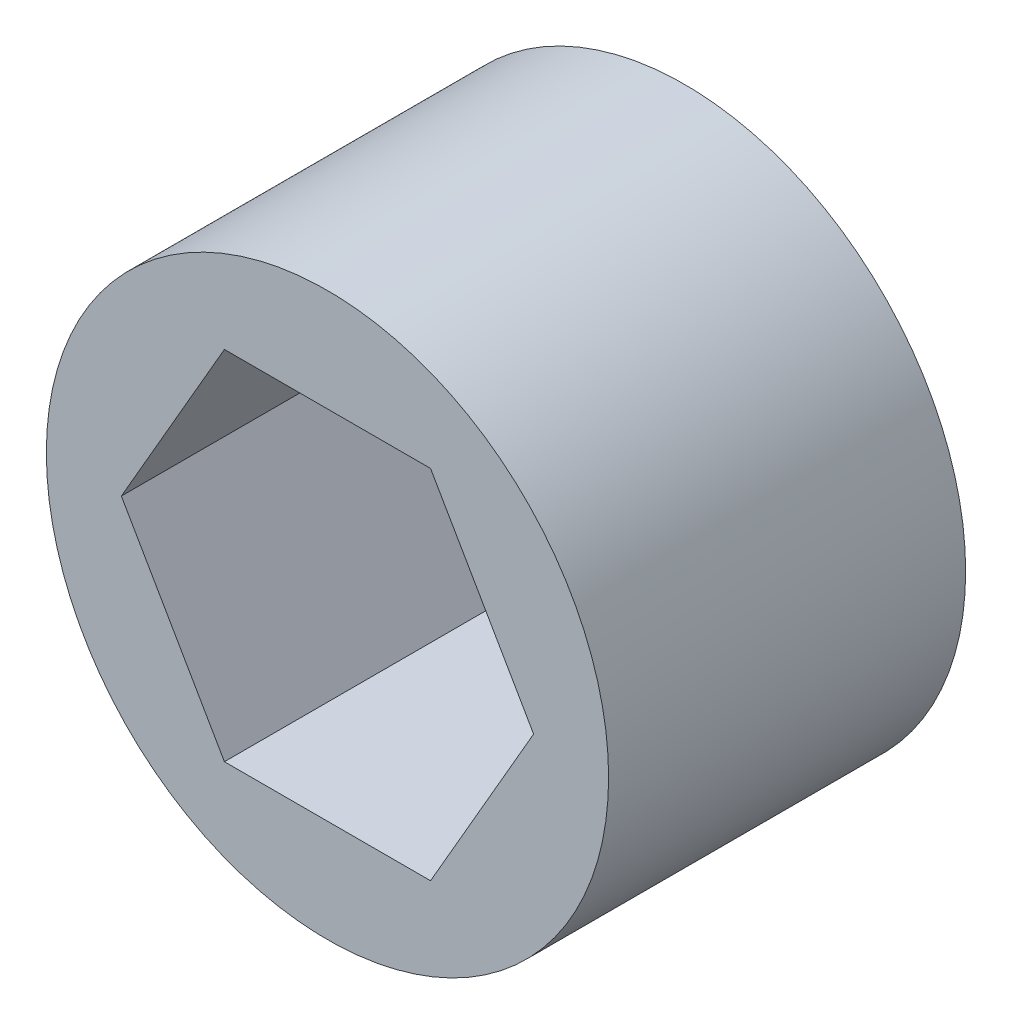
ISO-10303-21;
HEADER;
FILE_DESCRIPTION(('STEP AP214'),'2;1');
FILE_NAME('part.step','',(''),(''),'','','');
FILE_SCHEMA(('AUTOMOTIVE_DESIGN { 1 0 10303 214 1 1 1 1 }'));
ENDSEC;
DATA;
#1=APPLICATION_CONTEXT('core data for automotive mechanical design processes');
#2=APPLICATION_PROTOCOL_DEFINITION('international standard','automotive_design',2000,#1);
#3=PRODUCT_CONTEXT('',#1,'mechanical');
#4=PRODUCT('Part','Part','',(#3));
#5=PRODUCT_RELATED_PRODUCT_CATEGORY('part','',(#4));
#6=PRODUCT_DEFINITION_FORMATION('','',#4);
#7=PRODUCT_DEFINITION_CONTEXT('part definition',#1,'design');
#8=PRODUCT_DEFINITION('design','',#6,#7);
#9=PRODUCT_DEFINITION_SHAPE('','',#8);
#10=(LENGTH_UNIT() NAMED_UNIT(*) SI_UNIT(.MILLI.,.METRE.));
#11=(NAMED_UNIT(*) PLANE_ANGLE_UNIT() SI_UNIT($,.RADIAN.));
#12=(NAMED_UNIT(*) SI_UNIT($,.STERADIAN.) SOLID_ANGLE_UNIT());
#13=UNCERTAINTY_MEASURE_WITH_UNIT(LENGTH_MEASURE(1.E-05),#10,'distance_accuracy_value','');
#14=(GEOMETRIC_REPRESENTATION_CONTEXT(3) GLOBAL_UNCERTAINTY_ASSIGNED_CONTEXT((#13)) GLOBAL_UNIT_ASSIGNED_CONTEXT((#10,
#11,#12)) REPRESENTATION_CONTEXT('',''));
#15=CARTESIAN_POINT('',(0.,0.,0.));
#16=DIRECTION('',(0.,0.,1.));
#17=DIRECTION('',(1.,0.,0.));
#18=AXIS2_PLACEMENT_3D('',#15,#16,#17);
#19=CARTESIAN_POINT('',(-3.66617420935412,-6.35,12.7));
#20=DIRECTION('',(0.,1.,0.));
#21=DIRECTION('',(-1.,0.,0.));
#22=AXIS2_PLACEMENT_3D('',#19,#20,#21);
#23=PLANE('',#22);
#24=DIRECTION('',(1.,0.,0.));
#25=VECTOR('',#24,1.);
#26=CARTESIAN_POINT('',(0.,-6.35,12.7));
#27=LINE('',#26,#25);
#28=CARTESIAN_POINT('',(3.66617420935413,-6.35,12.7));
#29=VERTEX_POINT('',#28);
#30=CARTESIAN_POINT('',(-3.66617420935412,-6.35,12.7));
#31=VERTEX_POINT('',#30);
#32=EDGE_CURVE('E86',#29,#31,#27,.F.);
#33=ORIENTED_EDGE('',*,*,#32,.F.);
#34=DIRECTION('',(0.,0.,1.));
#35=VECTOR('',#34,1.);
#36=CARTESIAN_POINT('',(3.66617420935413,-6.35,12.7));
#37=LINE('',#36,#35);
#38=CARTESIAN_POINT('',(3.66617420935413,-6.35,0.));
#39=VERTEX_POINT('',#38);
#40=EDGE_CURVE('E78',#39,#29,#37,.T.);
#41=ORIENTED_EDGE('',*,*,#40,.F.);
#42=DIRECTION('',(1.,0.,0.));
#43=VECTOR('',#42,1.);
#44=CARTESIAN_POINT('',(0.,-6.35,0.));
#45=LINE('',#44,#43);
#46=CARTESIAN_POINT('',(-3.66617420935412,-6.35,0.));
#47=VERTEX_POINT('',#46);
#48=EDGE_CURVE('E121',#39,#47,#45,.F.);
#49=ORIENTED_EDGE('',*,*,#48,.T.);
#50=DIRECTION('',(0.,0.,1.));
#51=VECTOR('',#50,1.);
#52=CARTESIAN_POINT('',(-3.66617420935412,-6.35,12.7));
#53=LINE('',#52,#51);
#54=EDGE_CURVE('E103',#31,#47,#53,.F.);
#55=ORIENTED_EDGE('',*,*,#54,.F.);
#56=EDGE_LOOP('',(#33,#41,#49,#55));
#57=FACE_BOUND('',#56,.T.);
#58=ADVANCED_FACE('F17',(#57),#23,.T.);
#59=CARTESIAN_POINT('',(-7.33234841870825,0.,12.7));
#60=DIRECTION('',(0.866025403784439,0.5,0.));
#61=DIRECTION('',(-0.5,0.866025403784439,0.));
#62=AXIS2_PLACEMENT_3D('',#59,#60,#61);
#63=PLANE('',#62);
#64=DIRECTION('',(-0.5,0.866025403784438,0.));
#65=VECTOR('',#64,1.);
#66=CARTESIAN_POINT('',(-3.66617420935412,-6.35,12.7));
#67=LINE('',#66,#65);
#68=CARTESIAN_POINT('',(-7.33234841870825,0.,12.7));
#69=VERTEX_POINT('',#68);
#70=EDGE_CURVE('E126',#31,#69,#67,.T.);
#71=ORIENTED_EDGE('',*,*,#70,.F.);
#72=ORIENTED_EDGE('',*,*,#54,.T.);
#73=DIRECTION('',(-0.5,0.866025403784438,0.));
#74=VECTOR('',#73,1.);
#75=CARTESIAN_POINT('',(-3.66617420935412,-6.35,0.));
#76=LINE('',#75,#74);
#77=CARTESIAN_POINT('',(-7.33234841870825,0.,0.));
#78=VERTEX_POINT('',#77);
#79=EDGE_CURVE('E119',#47,#78,#76,.T.);
#80=ORIENTED_EDGE('',*,*,#79,.T.);
#81=DIRECTION('',(0.,0.,1.));
#82=VECTOR('',#81,1.);
#83=CARTESIAN_POINT('',(-7.33234841870825,0.,12.7));
#84=LINE('',#83,#82);
#85=EDGE_CURVE('E100',#69,#78,#84,.F.);
#86=ORIENTED_EDGE('',*,*,#85,.F.);
#87=EDGE_LOOP('',(#71,#72,#80,#86));
#88=FACE_BOUND('',#87,.T.);
#89=ADVANCED_FACE('F132',(#88),#63,.T.);
#90=CARTESIAN_POINT('',(-3.66617420935412,6.35,12.7));
#91=DIRECTION('',(0.866025403784439,-0.5,0.));
#92=DIRECTION('',(0.5,0.866025403784439,0.));
#93=AXIS2_PLACEMENT_3D('',#90,#91,#92);
#94=PLANE('',#93);
#95=DIRECTION('',(0.5,0.866025403784439,0.));
#96=VECTOR('',#95,1.);
#97=CARTESIAN_POINT('',(-7.33234841870825,0.,12.7));
#98=LINE('',#97,#96);
#99=CARTESIAN_POINT('',(-3.66617420935412,6.35,12.7));
#100=VERTEX_POINT('',#99);
#101=EDGE_CURVE('E124',#69,#100,#98,.T.);
#102=ORIENTED_EDGE('',*,*,#101,.F.);
#103=ORIENTED_EDGE('',*,*,#85,.T.);
#104=DIRECTION('',(0.5,0.866025403784439,0.));
#105=VECTOR('',#104,1.);
#106=CARTESIAN_POINT('',(-7.33234841870825,0.,0.));
#107=LINE('',#106,#105);
#108=CARTESIAN_POINT('',(-3.66617420935412,6.35,0.));
#109=VERTEX_POINT('',#108);
#110=EDGE_CURVE('E117',#78,#109,#107,.T.);
#111=ORIENTED_EDGE('',*,*,#110,.T.);
#112=DIRECTION('',(0.,0.,-1.));
#113=VECTOR('',#112,1.);
#114=CARTESIAN_POINT('',(-3.66617420935412,6.35,12.7));
#115=LINE('',#114,#113);
#116=EDGE_CURVE('E97',#100,#109,#115,.T.);
#117=ORIENTED_EDGE('',*,*,#116,.F.);
#118=EDGE_LOOP('',(#102,#103,#111,#117));
#119=FACE_BOUND('',#118,.T.);
#120=ADVANCED_FACE('F136',(#119),#94,.T.);
#121=CARTESIAN_POINT('',(3.66617420935412,6.35,12.7));
#122=DIRECTION('',(0.,-1.,0.));
#123=DIRECTION('',(0.,0.,-1.));
#124=AXIS2_PLACEMENT_3D('',#121,#122,#123);
#125=PLANE('',#124);
#126=DIRECTION('',(1.,0.,0.));
#127=VECTOR('',#126,1.);
#128=CARTESIAN_POINT('',(0.,6.35,12.7));
#129=LINE('',#128,#127);
#130=CARTESIAN_POINT('',(3.66617420935412,6.35,12.7));
#131=VERTEX_POINT('',#130);
#132=EDGE_CURVE('E91',#100,#131,#129,.T.);
#133=ORIENTED_EDGE('',*,*,#132,.F.);
#134=ORIENTED_EDGE('',*,*,#116,.T.);
#135=DIRECTION('',(1.,0.,0.));
#136=VECTOR('',#135,1.);
#137=CARTESIAN_POINT('',(0.,6.35,0.));
#138=LINE('',#137,#136);
#139=CARTESIAN_POINT('',(3.66617420935412,6.35,0.));
#140=VERTEX_POINT('',#139);
#141=EDGE_CURVE('E113',#109,#140,#138,.T.);
#142=ORIENTED_EDGE('',*,*,#141,.T.);
#143=DIRECTION('',(0.,0.,1.));
#144=VECTOR('',#143,1.);
#145=CARTESIAN_POINT('',(3.66617420935412,6.35,12.7));
#146=LINE('',#145,#144);
#147=EDGE_CURVE('E67',#131,#140,#146,.F.);
#148=ORIENTED_EDGE('',*,*,#147,.F.);
#149=EDGE_LOOP('',(#133,#134,#142,#148));
#150=FACE_BOUND('',#149,.T.);
#151=ADVANCED_FACE('F138',(#150),#125,.T.);
#152=CARTESIAN_POINT('',(7.33234841870825,0.,12.7));
#153=DIRECTION('',(-0.866025403784439,-0.5,0.));
#154=DIRECTION('',(0.5,-0.866025403784439,0.));
#155=AXIS2_PLACEMENT_3D('',#152,#153,#154);
#156=PLANE('',#155);
#157=DIRECTION('',(0.5,-0.866025403784439,0.));
#158=VECTOR('',#157,1.);
#159=CARTESIAN_POINT('',(3.66617420935412,6.35,12.7));
#160=LINE('',#159,#158);
#161=CARTESIAN_POINT('',(7.33234841870825,0.,12.7));
#162=VERTEX_POINT('',#161);
#163=EDGE_CURVE('E73',#131,#162,#160,.T.);
#164=ORIENTED_EDGE('',*,*,#163,.F.);
#165=ORIENTED_EDGE('',*,*,#147,.T.);
#166=DIRECTION('',(0.5,-0.866025403784439,0.));
#167=VECTOR('',#166,1.);
#168=CARTESIAN_POINT('',(3.66617420935412,6.35,0.));
#169=LINE('',#168,#167);
#170=CARTESIAN_POINT('',(7.33234841870825,0.,0.));
#171=VERTEX_POINT('',#170);
#172=EDGE_CURVE('E35',#140,#171,#169,.T.);
#173=ORIENTED_EDGE('',*,*,#172,.T.);
#174=DIRECTION('',(0.,0.,1.));
#175=VECTOR('',#174,1.);
#176=CARTESIAN_POINT('',(7.33234841870825,0.,12.7));
#177=LINE('',#176,#175);
#178=EDGE_CURVE('E69',#162,#171,#177,.F.);
#179=ORIENTED_EDGE('',*,*,#178,.F.);
#180=EDGE_LOOP('',(#164,#165,#173,#179));
#181=FACE_BOUND('',#180,.T.);
#182=ADVANCED_FACE('F71',(#181),#156,.T.);
#183=CARTESIAN_POINT('',(3.66617420935413,-6.35,12.7));
#184=DIRECTION('',(-0.866025403784439,0.5,0.));
#185=DIRECTION('',(-0.5,-0.866025403784439,0.));
#186=AXIS2_PLACEMENT_3D('',#183,#184,#185);
#187=PLANE('',#186);
#188=DIRECTION('',(-0.5,-0.866025403784439,0.));
#189=VECTOR('',#188,1.);
#190=CARTESIAN_POINT('',(7.33234841870825,0.,12.7));
#191=LINE('',#190,#189);
#192=EDGE_CURVE('E81',#162,#29,#191,.T.);
#193=ORIENTED_EDGE('',*,*,#192,.F.);
#194=ORIENTED_EDGE('',*,*,#178,.T.);
#195=DIRECTION('',(-0.5,-0.866025403784439,0.));
#196=VECTOR('',#195,1.);
#197=CARTESIAN_POINT('',(7.33234841870825,0.,0.));
#198=LINE('',#197,#196);
#199=EDGE_CURVE('E108',#171,#39,#198,.T.);
#200=ORIENTED_EDGE('',*,*,#199,.T.);
#201=ORIENTED_EDGE('',*,*,#40,.T.);
#202=EDGE_LOOP('',(#193,#194,#200,#201));
#203=FACE_BOUND('',#202,.T.);
#204=ADVANCED_FACE('F82',(#203),#187,.T.);
#205=CARTESIAN_POINT('',(0.,0.,12.7));
#206=DIRECTION('',(0.,0.,1.));
#207=DIRECTION('',(1.,0.,0.));
#208=AXIS2_PLACEMENT_3D('',#205,#206,#207);
#209=PLANE('',#208);
#210=ORIENTED_EDGE('',*,*,#101,.T.);
#211=ORIENTED_EDGE('',*,*,#132,.T.);
#212=ORIENTED_EDGE('',*,*,#163,.T.);
#213=ORIENTED_EDGE('',*,*,#192,.T.);
#214=ORIENTED_EDGE('',*,*,#32,.T.);
#215=ORIENTED_EDGE('',*,*,#70,.T.);
#216=EDGE_LOOP('',(#210,#211,#212,#213,#214,#215));
#217=FACE_BOUND('',#216,.T.);
#218=CARTESIAN_POINT('',(0.,0.,12.7));
#219=DIRECTION('',(0.,0.,-1.));
#220=DIRECTION('',(-1.,0.,0.));
#221=AXIS2_PLACEMENT_3D('',#218,#219,#220);
#222=CIRCLE('',#221,10.);
#223=CARTESIAN_POINT('',(-10.,0.,12.7));
#224=VERTEX_POINT('',#223);
#225=EDGE_CURVE('E26',#224,#224,#222,.T.);
#226=ORIENTED_EDGE('',*,*,#225,.F.);
#227=EDGE_LOOP('',(#226));
#228=FACE_BOUND('',#227,.T.);
#229=ADVANCED_FACE('F89',(#217,#228),#209,.T.);
#230=CARTESIAN_POINT('',(0.,0.,0.));
#231=DIRECTION('',(0.,0.,1.));
#232=DIRECTION('',(1.,0.,0.));
#233=AXIS2_PLACEMENT_3D('',#230,#231,#232);
#234=PLANE('',#233);
#235=ORIENTED_EDGE('',*,*,#172,.F.);
#236=ORIENTED_EDGE('',*,*,#141,.F.);
#237=ORIENTED_EDGE('',*,*,#110,.F.);
#238=ORIENTED_EDGE('',*,*,#79,.F.);
#239=ORIENTED_EDGE('',*,*,#48,.F.);
#240=ORIENTED_EDGE('',*,*,#199,.F.);
#241=EDGE_LOOP('',(#235,#236,#237,#238,#239,#240));
#242=FACE_BOUND('',#241,.T.);
#243=CARTESIAN_POINT('',(0.,0.,0.));
#244=DIRECTION('',(0.,0.,-1.));
#245=DIRECTION('',(-1.,0.,0.));
#246=AXIS2_PLACEMENT_3D('',#243,#244,#245);
#247=CIRCLE('',#246,10.);
#248=CARTESIAN_POINT('',(-10.,0.,0.));
#249=VERTEX_POINT('',#248);
#250=EDGE_CURVE('E11',#249,#249,#247,.F.);
#251=ORIENTED_EDGE('',*,*,#250,.F.);
#252=EDGE_LOOP('',(#251));
#253=FACE_BOUND('',#252,.T.);
#254=ADVANCED_FACE('F150',(#242,#253),#234,.F.);
#255=CARTESIAN_POINT('',(0.,0.,12.7));
#256=DIRECTION('',(0.,0.,-1.));
#257=DIRECTION('',(-1.,0.,0.));
#258=AXIS2_PLACEMENT_3D('',#255,#256,#257);
#259=CYLINDRICAL_SURFACE('',#258,10.);
#260=ORIENTED_EDGE('',*,*,#250,.T.);
#261=EDGE_LOOP('',(#260));
#262=FACE_BOUND('',#261,.T.);
#263=ORIENTED_EDGE('',*,*,#225,.T.);
#264=EDGE_LOOP('',(#263));
#265=FACE_BOUND('',#264,.T.);
#266=ADVANCED_FACE('F148',(#262,#265),#259,.T.);
#267=CLOSED_SHELL('',(#58,#89,#120,#151,#182,#204,#229,#254,#266));
#268=MANIFOLD_SOLID_BREP('B1',#267);
#269=ADVANCED_BREP_SHAPE_REPRESENTATION('',(#18,#268),#14);
#270=SHAPE_DEFINITION_REPRESENTATION(#9,#269);
ENDSEC;
END-ISO-10303-21;
